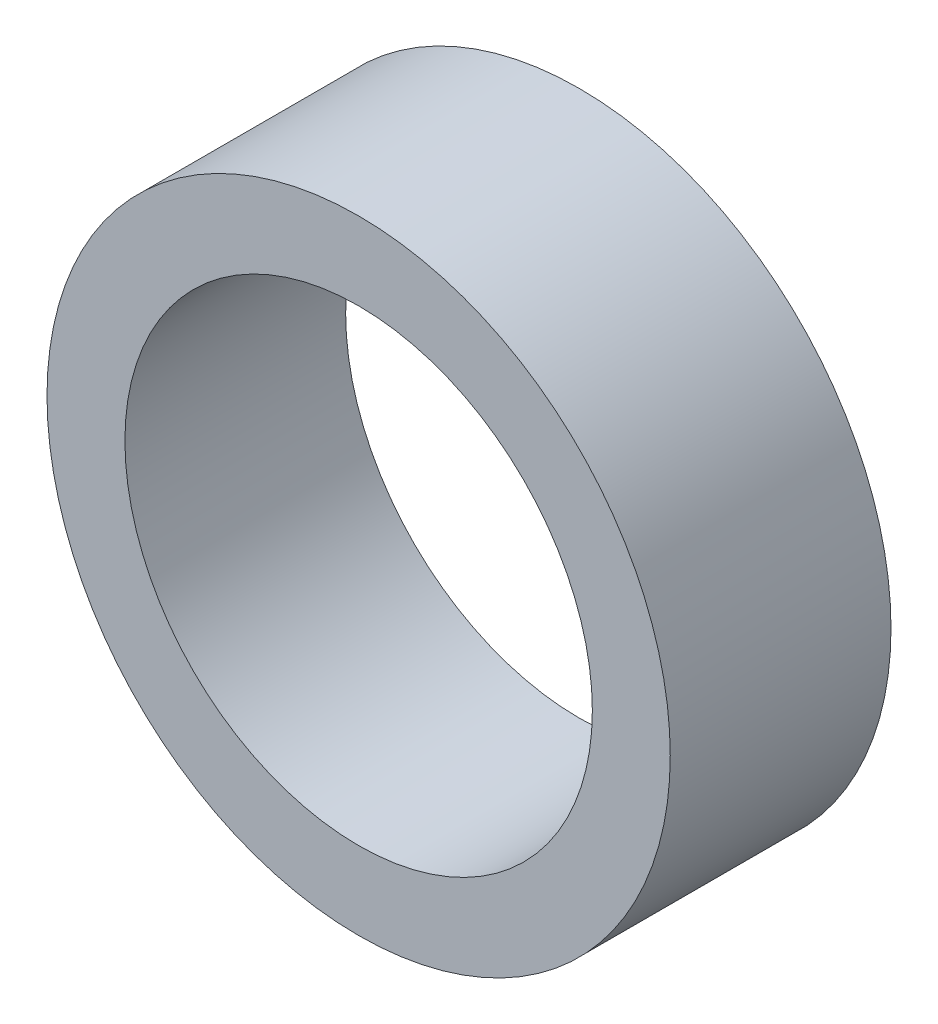
ISO-10303-21;
HEADER;
FILE_DESCRIPTION(('STEP AP214'),'2;1');
FILE_NAME('part.step','',(''),(''),'','','');
FILE_SCHEMA(('AUTOMOTIVE_DESIGN { 1 0 10303 214 1 1 1 1 }'));
ENDSEC;
DATA;
#1=APPLICATION_CONTEXT('core data for automotive mechanical design processes');
#2=APPLICATION_PROTOCOL_DEFINITION('international standard','automotive_design',2000,#1);
#3=PRODUCT_CONTEXT('',#1,'mechanical');
#4=PRODUCT('Part','Part','',(#3));
#5=PRODUCT_RELATED_PRODUCT_CATEGORY('part','',(#4));
#6=PRODUCT_DEFINITION_FORMATION('','',#4);
#7=PRODUCT_DEFINITION_CONTEXT('part definition',#1,'design');
#8=PRODUCT_DEFINITION('design','',#6,#7);
#9=PRODUCT_DEFINITION_SHAPE('','',#8);
#10=(LENGTH_UNIT() NAMED_UNIT(*) SI_UNIT(.MILLI.,.METRE.));
#11=(NAMED_UNIT(*) PLANE_ANGLE_UNIT() SI_UNIT($,.RADIAN.));
#12=(NAMED_UNIT(*) SI_UNIT($,.STERADIAN.) SOLID_ANGLE_UNIT());
#13=UNCERTAINTY_MEASURE_WITH_UNIT(LENGTH_MEASURE(1.E-05),#10,'distance_accuracy_value','');
#14=(GEOMETRIC_REPRESENTATION_CONTEXT(3) GLOBAL_UNCERTAINTY_ASSIGNED_CONTEXT((#13)) GLOBAL_UNIT_ASSIGNED_CONTEXT((#10,
#11,#12)) REPRESENTATION_CONTEXT('',''));
#15=CARTESIAN_POINT('',(0.,0.,0.));
#16=DIRECTION('',(0.,0.,1.));
#17=DIRECTION('',(1.,0.,0.));
#18=AXIS2_PLACEMENT_3D('',#15,#16,#17);
#19=CARTESIAN_POINT('',(0.,0.,8.5));
#20=DIRECTION('',(0.,0.,1.));
#21=DIRECTION('',(1.,0.,0.));
#22=AXIS2_PLACEMENT_3D('',#19,#20,#21);
#23=PLANE('',#22);
#24=CARTESIAN_POINT('',(0.,0.,8.5));
#25=DIRECTION('',(0.,0.,1.));
#26=DIRECTION('',(1.,0.,0.));
#27=AXIS2_PLACEMENT_3D('',#24,#25,#26);
#28=CIRCLE('',#27,24.);
#29=CARTESIAN_POINT('',(24.,0.,8.5));
#30=VERTEX_POINT('',#29);
#31=EDGE_CURVE('E10',#30,#30,#28,.T.);
#32=ORIENTED_EDGE('',*,*,#31,.T.);
#33=EDGE_LOOP('',(#32));
#34=FACE_BOUND('',#33,.T.);
#35=CARTESIAN_POINT('',(0.,0.,8.5));
#36=DIRECTION('',(0.,0.,1.));
#37=DIRECTION('',(1.,0.,0.));
#38=AXIS2_PLACEMENT_3D('',#35,#36,#37);
#39=CIRCLE('',#38,18.);
#40=CARTESIAN_POINT('',(18.,0.,8.5));
#41=VERTEX_POINT('',#40);
#42=EDGE_CURVE('E55',#41,#41,#39,.T.);
#43=ORIENTED_EDGE('',*,*,#42,.F.);
#44=EDGE_LOOP('',(#43));
#45=FACE_BOUND('',#44,.T.);
#46=ADVANCED_FACE('F41',(#34,#45),#23,.T.);
#47=CARTESIAN_POINT('',(0.,0.,-8.5));
#48=DIRECTION('',(0.,0.,1.));
#49=DIRECTION('',(1.,0.,0.));
#50=AXIS2_PLACEMENT_3D('',#47,#48,#49);
#51=PLANE('',#50);
#52=CARTESIAN_POINT('',(0.,0.,-8.5));
#53=DIRECTION('',(0.,0.,1.));
#54=DIRECTION('',(1.,0.,0.));
#55=AXIS2_PLACEMENT_3D('',#52,#53,#54);
#56=CIRCLE('',#55,24.);
#57=CARTESIAN_POINT('',(24.,0.,-8.5));
#58=VERTEX_POINT('',#57);
#59=EDGE_CURVE('E45',#58,#58,#56,.T.);
#60=ORIENTED_EDGE('',*,*,#59,.F.);
#61=EDGE_LOOP('',(#60));
#62=FACE_BOUND('',#61,.T.);
#63=CARTESIAN_POINT('',(0.,0.,-8.5));
#64=DIRECTION('',(0.,0.,1.));
#65=DIRECTION('',(1.,0.,0.));
#66=AXIS2_PLACEMENT_3D('',#63,#64,#65);
#67=CIRCLE('',#66,18.);
#68=CARTESIAN_POINT('',(18.,0.,-8.5));
#69=VERTEX_POINT('',#68);
#70=EDGE_CURVE('E57',#69,#69,#67,.T.);
#71=ORIENTED_EDGE('',*,*,#70,.T.);
#72=EDGE_LOOP('',(#71));
#73=FACE_BOUND('',#72,.T.);
#74=ADVANCED_FACE('F70',(#62,#73),#51,.F.);
#75=CARTESIAN_POINT('',(0.,0.,8.5));
#76=DIRECTION('',(0.,0.,-1.));
#77=DIRECTION('',(-1.,0.,0.));
#78=AXIS2_PLACEMENT_3D('',#75,#76,#77);
#79=CYLINDRICAL_SURFACE('',#78,24.);
#80=ORIENTED_EDGE('',*,*,#31,.F.);
#81=EDGE_LOOP('',(#80));
#82=FACE_BOUND('',#81,.T.);
#83=ORIENTED_EDGE('',*,*,#59,.T.);
#84=EDGE_LOOP('',(#83));
#85=FACE_BOUND('',#84,.T.);
#86=ADVANCED_FACE('F43',(#82,#85),#79,.T.);
#87=CARTESIAN_POINT('',(0.,0.,8.5));
#88=DIRECTION('',(0.,0.,-1.));
#89=DIRECTION('',(-1.,0.,0.));
#90=AXIS2_PLACEMENT_3D('',#87,#88,#89);
#91=CYLINDRICAL_SURFACE('',#90,18.);
#92=ORIENTED_EDGE('',*,*,#42,.T.);
#93=EDGE_LOOP('',(#92));
#94=FACE_BOUND('',#93,.T.);
#95=ORIENTED_EDGE('',*,*,#70,.F.);
#96=EDGE_LOOP('',(#95));
#97=FACE_BOUND('',#96,.T.);
#98=ADVANCED_FACE('F66',(#94,#97),#91,.F.);
#99=CLOSED_SHELL('',(#46,#74,#86,#98));
#100=MANIFOLD_SOLID_BREP('B2',#99);
#101=ADVANCED_BREP_SHAPE_REPRESENTATION('',(#18,#100),#14);
#102=SHAPE_DEFINITION_REPRESENTATION(#9,#101);
ENDSEC;
END-ISO-10303-21;
